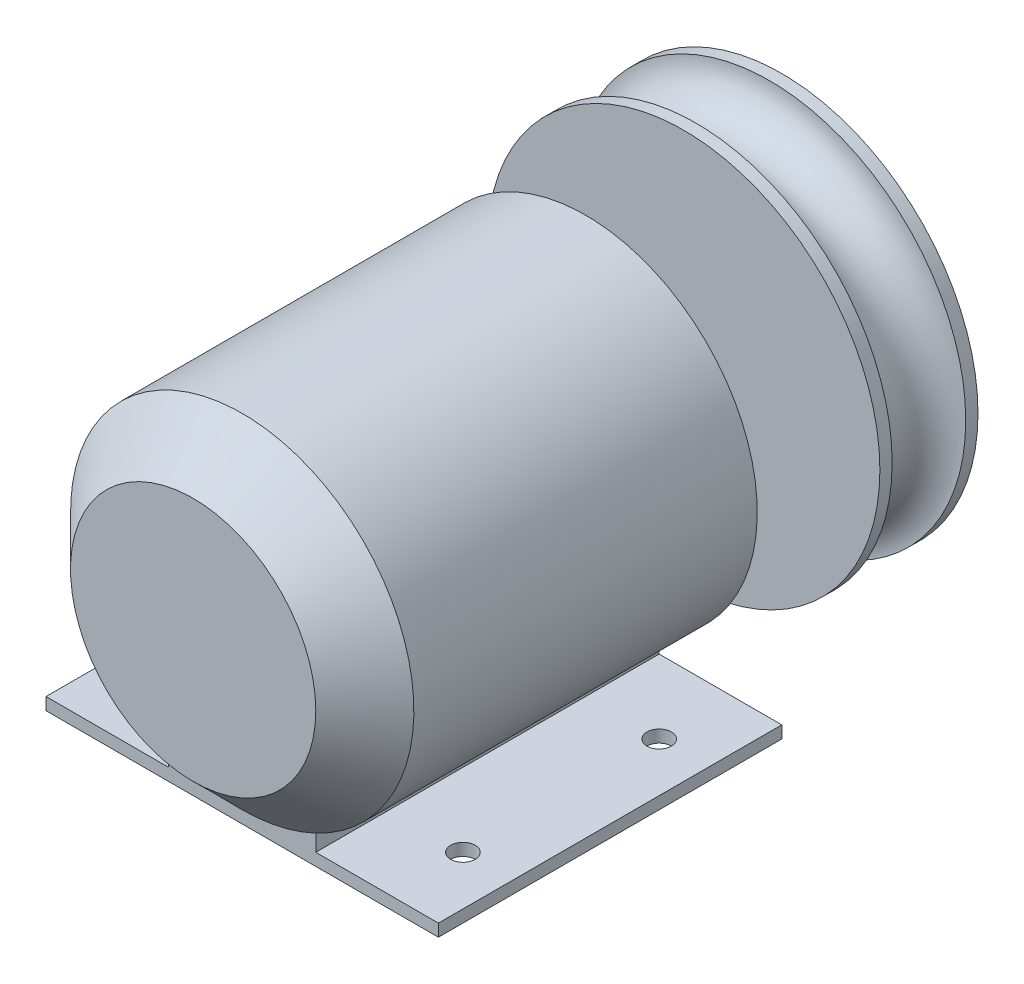
ISO-10303-21;
HEADER;
FILE_DESCRIPTION(('STEP AP214'),'2;1');
FILE_NAME('part.step','',(''),(''),'','','');
FILE_SCHEMA(('AUTOMOTIVE_DESIGN { 1 0 10303 214 1 1 1 1 }'));
ENDSEC;
DATA;
#1=APPLICATION_CONTEXT('core data for automotive mechanical design processes');
#2=APPLICATION_PROTOCOL_DEFINITION('international standard','automotive_design',2000,#1);
#3=PRODUCT_CONTEXT('',#1,'mechanical');
#4=PRODUCT('Part','Part','',(#3));
#5=PRODUCT_RELATED_PRODUCT_CATEGORY('part','',(#4));
#6=PRODUCT_DEFINITION_FORMATION('','',#4);
#7=PRODUCT_DEFINITION_CONTEXT('part definition',#1,'design');
#8=PRODUCT_DEFINITION('design','',#6,#7);
#9=PRODUCT_DEFINITION_SHAPE('','',#8);
#10=(LENGTH_UNIT() NAMED_UNIT(*) SI_UNIT(.MILLI.,.METRE.));
#11=(NAMED_UNIT(*) PLANE_ANGLE_UNIT() SI_UNIT($,.RADIAN.));
#12=(NAMED_UNIT(*) SI_UNIT($,.STERADIAN.) SOLID_ANGLE_UNIT());
#13=UNCERTAINTY_MEASURE_WITH_UNIT(LENGTH_MEASURE(1.E-05),#10,'distance_accuracy_value','');
#14=(GEOMETRIC_REPRESENTATION_CONTEXT(3) GLOBAL_UNCERTAINTY_ASSIGNED_CONTEXT((#13)) GLOBAL_UNIT_ASSIGNED_CONTEXT((#10,
#11,#12)) REPRESENTATION_CONTEXT('',''));
#15=CARTESIAN_POINT('',(0.,0.,0.));
#16=DIRECTION('',(0.,0.,1.));
#17=DIRECTION('',(1.,0.,0.));
#18=AXIS2_PLACEMENT_3D('',#15,#16,#17);
#19=CARTESIAN_POINT('',(0.,0.,0.));
#20=DIRECTION('',(0.,0.,1.));
#21=DIRECTION('',(1.,0.,0.));
#22=AXIS2_PLACEMENT_3D('',#19,#20,#21);
#23=PLANE('',#22);
#24=DIRECTION('',(0.,-1.,0.));
#25=VECTOR('',#24,1.);
#26=CARTESIAN_POINT('',(-19.05,-44.45,0.));
#27=LINE('',#26,#25);
#28=CARTESIAN_POINT('',(-19.05,-40.1609262841384,0.));
#29=VERTEX_POINT('',#28);
#30=CARTESIAN_POINT('',(-19.05,-44.45,0.));
#31=VERTEX_POINT('',#30);
#32=EDGE_CURVE('E138',#29,#31,#27,.T.);
#33=ORIENTED_EDGE('',*,*,#32,.F.);
#34=CARTESIAN_POINT('',(0.,0.,0.));
#35=DIRECTION('',(0.,0.,1.));
#36=DIRECTION('',(1.,0.,0.));
#37=AXIS2_PLACEMENT_3D('',#34,#35,#36);
#38=CIRCLE('',#37,44.45);
#39=CARTESIAN_POINT('',(19.05,-40.1609262841384,0.));
#40=VERTEX_POINT('',#39);
#41=EDGE_CURVE('E55',#40,#29,#38,.T.);
#42=ORIENTED_EDGE('',*,*,#41,.F.);
#43=DIRECTION('',(0.,1.,0.));
#44=VECTOR('',#43,1.);
#45=CARTESIAN_POINT('',(19.05,-44.45,0.));
#46=LINE('',#45,#44);
#47=CARTESIAN_POINT('',(19.05,-44.45,0.));
#48=VERTEX_POINT('',#47);
#49=EDGE_CURVE('E141',#48,#40,#46,.T.);
#50=ORIENTED_EDGE('',*,*,#49,.F.);
#51=DIRECTION('',(-1.,0.,0.));
#52=VECTOR('',#51,1.);
#53=CARTESIAN_POINT('',(50.8,-44.45,0.));
#54=LINE('',#53,#52);
#55=CARTESIAN_POINT('',(50.8,-44.45,0.));
#56=VERTEX_POINT('',#55);
#57=EDGE_CURVE('E208',#56,#48,#54,.T.);
#58=ORIENTED_EDGE('',*,*,#57,.F.);
#59=DIRECTION('',(0.,1.,0.));
#60=VECTOR('',#59,1.);
#61=CARTESIAN_POINT('',(50.8,-44.45,0.));
#62=LINE('',#61,#60);
#63=CARTESIAN_POINT('',(50.8,-47.625,0.));
#64=VERTEX_POINT('',#63);
#65=EDGE_CURVE('E126',#64,#56,#62,.T.);
#66=ORIENTED_EDGE('',*,*,#65,.F.);
#67=DIRECTION('',(1.,0.,0.));
#68=VECTOR('',#67,1.);
#69=CARTESIAN_POINT('',(50.8,-47.625,0.));
#70=LINE('',#69,#68);
#71=CARTESIAN_POINT('',(-50.8,-47.625,0.));
#72=VERTEX_POINT('',#71);
#73=EDGE_CURVE('E122',#72,#64,#70,.T.);
#74=ORIENTED_EDGE('',*,*,#73,.F.);
#75=DIRECTION('',(0.,-1.,0.));
#76=VECTOR('',#75,1.);
#77=CARTESIAN_POINT('',(-50.8,-44.45,0.));
#78=LINE('',#77,#76);
#79=CARTESIAN_POINT('',(-50.8,-44.45,0.));
#80=VERTEX_POINT('',#79);
#81=EDGE_CURVE('E210',#80,#72,#78,.T.);
#82=ORIENTED_EDGE('',*,*,#81,.F.);
#83=EDGE_CURVE('E207',#31,#80,#54,.T.);
#84=ORIENTED_EDGE('',*,*,#83,.F.);
#85=EDGE_LOOP('',(#33,#42,#50,#58,#66,#74,#82,#84));
#86=FACE_BOUND('',#85,.T.);
#87=CARTESIAN_POINT('',(0.,0.,0.));
#88=DIRECTION('',(0.,0.,1.));
#89=DIRECTION('',(1.,0.,0.));
#90=AXIS2_PLACEMENT_3D('',#87,#88,#89);
#91=CIRCLE('',#90,3.175);
#92=CARTESIAN_POINT('',(3.175,0.,0.));
#93=VERTEX_POINT('',#92);
#94=EDGE_CURVE('E11',#93,#93,#91,.F.);
#95=ORIENTED_EDGE('',*,*,#94,.F.);
#96=EDGE_LOOP('',(#95));
#97=FACE_BOUND('',#96,.T.);
#98=ADVANCED_FACE('F34',(#86,#97),#23,.F.);
#99=CARTESIAN_POINT('',(0.,0.,101.6));
#100=DIRECTION('',(0.,0.,-1.));
#101=DIRECTION('',(-1.,0.,0.));
#102=AXIS2_PLACEMENT_3D('',#99,#100,#101);
#103=CYLINDRICAL_SURFACE('',#102,44.45);
#104=ORIENTED_EDGE('',*,*,#41,.T.);
#105=DIRECTION('',(0.,0.,-1.));
#106=VECTOR('',#105,1.);
#107=CARTESIAN_POINT('',(-19.05,-40.1609262841384,101.6));
#108=LINE('',#107,#106);
#109=CARTESIAN_POINT('',(-19.05,-40.1609262841384,88.9));
#110=VERTEX_POINT('',#109);
#111=EDGE_CURVE('E150',#29,#110,#108,.F.);
#112=ORIENTED_EDGE('',*,*,#111,.T.);
#113=CARTESIAN_POINT('',(0.,0.,88.9));
#114=DIRECTION('',(0.,0.,1.));
#115=DIRECTION('',(1.,0.,0.));
#116=AXIS2_PLACEMENT_3D('',#113,#114,#115);
#117=CIRCLE('',#116,44.45);
#118=CARTESIAN_POINT('',(19.05,-40.1609262841384,88.9));
#119=VERTEX_POINT('',#118);
#120=EDGE_CURVE('E177',#110,#119,#117,.F.);
#121=ORIENTED_EDGE('',*,*,#120,.T.);
#122=DIRECTION('',(0.,0.,-1.));
#123=VECTOR('',#122,1.);
#124=CARTESIAN_POINT('',(19.05,-40.1609262841384,101.6));
#125=LINE('',#124,#123);
#126=EDGE_CURVE('E51',#119,#40,#125,.T.);
#127=ORIENTED_EDGE('',*,*,#126,.T.);
#128=EDGE_LOOP('',(#104,#112,#121,#127));
#129=FACE_BOUND('',#128,.T.);
#130=ADVANCED_FACE('F232',(#129),#103,.T.);
#131=CARTESIAN_POINT('',(0.,0.,101.6));
#132=DIRECTION('',(0.,0.,1.));
#133=DIRECTION('',(1.,0.,0.));
#134=AXIS2_PLACEMENT_3D('',#131,#132,#133);
#135=PLANE('',#134);
#136=CARTESIAN_POINT('',(0.,0.,101.6));
#137=DIRECTION('',(0.,0.,1.));
#138=DIRECTION('',(1.,0.,0.));
#139=AXIS2_PLACEMENT_3D('',#136,#137,#138);
#140=CIRCLE('',#139,31.75);
#141=CARTESIAN_POINT('',(31.75,0.,101.6));
#142=VERTEX_POINT('',#141);
#143=EDGE_CURVE('E174',#142,#142,#140,.T.);
#144=ORIENTED_EDGE('',*,*,#143,.T.);
#145=EDGE_LOOP('',(#144));
#146=FACE_BOUND('',#145,.T.);
#147=ADVANCED_FACE('F256',(#146),#135,.T.);
#148=CARTESIAN_POINT('',(0.,0.,101.6));
#149=DIRECTION('',(0.,0.,-1.));
#150=DIRECTION('',(-1.,0.,0.));
#151=AXIS2_PLACEMENT_3D('',#148,#149,#150);
#152=CONICAL_SURFACE('',#151,31.75,0.785398163397447);
#153=EDGE_CURVE('E43',#119,#110,#117,.F.);
#154=ORIENTED_EDGE('',*,*,#153,.F.);
#155=ORIENTED_EDGE('',*,*,#120,.F.);
#156=EDGE_LOOP('',(#154,#155));
#157=FACE_BOUND('',#156,.T.);
#158=ORIENTED_EDGE('',*,*,#143,.F.);
#159=EDGE_LOOP('',(#158));
#160=FACE_BOUND('',#159,.T.);
#161=ADVANCED_FACE('F36',(#157,#160),#152,.T.);
#162=CARTESIAN_POINT('',(0.,0.,-25.4));
#163=DIRECTION('',(0.,0.,1.));
#164=DIRECTION('',(1.,0.,0.));
#165=AXIS2_PLACEMENT_3D('',#162,#163,#164);
#166=CYLINDRICAL_SURFACE('',#165,3.175);
#167=CARTESIAN_POINT('',(0.,0.,-25.4));
#168=DIRECTION('',(0.,0.,-1.));
#169=DIRECTION('',(-1.,0.,0.));
#170=AXIS2_PLACEMENT_3D('',#167,#168,#169);
#171=CIRCLE('',#170,3.175);
#172=CARTESIAN_POINT('',(-3.175,0.,-25.4));
#173=VERTEX_POINT('',#172);
#174=EDGE_CURVE('E170',#173,#173,#171,.T.);
#175=ORIENTED_EDGE('',*,*,#174,.F.);
#176=EDGE_LOOP('',(#175));
#177=FACE_BOUND('',#176,.T.);
#178=ORIENTED_EDGE('',*,*,#94,.T.);
#179=EDGE_LOOP('',(#178));
#180=FACE_BOUND('',#179,.T.);
#181=ADVANCED_FACE('F261',(#177,#180),#166,.T.);
#182=CARTESIAN_POINT('',(0.,0.,-25.4));
#183=DIRECTION('',(0.,0.,-1.));
#184=DIRECTION('',(-1.,0.,0.));
#185=AXIS2_PLACEMENT_3D('',#182,#183,#184);
#186=PLANE('',#185);
#187=CARTESIAN_POINT('',(0.,0.,-25.4));
#188=DIRECTION('',(0.,0.,1.));
#189=DIRECTION('',(1.,0.,0.));
#190=AXIS2_PLACEMENT_3D('',#187,#188,#189);
#191=CIRCLE('',#190,50.8);
#192=CARTESIAN_POINT('',(50.8,0.,-25.4));
#193=VERTEX_POINT('',#192);
#194=EDGE_CURVE('E156',#193,#193,#191,.T.);
#195=ORIENTED_EDGE('',*,*,#194,.T.);
#196=EDGE_LOOP('',(#195));
#197=FACE_BOUND('',#196,.T.);
#198=ORIENTED_EDGE('',*,*,#174,.T.);
#199=EDGE_LOOP('',(#198));
#200=FACE_BOUND('',#199,.T.);
#201=ADVANCED_FACE('F264',(#197,#200),#186,.F.);
#202=CARTESIAN_POINT('',(0.,0.,-50.8));
#203=DIRECTION('',(0.,0.,1.));
#204=DIRECTION('',(1.,0.,0.));
#205=AXIS2_PLACEMENT_3D('',#202,#203,#204);
#206=PLANE('',#205);
#207=CARTESIAN_POINT('',(0.,0.,-50.8));
#208=DIRECTION('',(0.,0.,-1.));
#209=DIRECTION('',(-1.,0.,0.));
#210=AXIS2_PLACEMENT_3D('',#207,#208,#209);
#211=CIRCLE('',#210,44.45);
#212=CARTESIAN_POINT('',(-44.45,0.,-50.8));
#213=VERTEX_POINT('',#212);
#214=EDGE_CURVE('E152',#213,#213,#211,.T.);
#215=ORIENTED_EDGE('',*,*,#214,.F.);
#216=EDGE_LOOP('',(#215));
#217=FACE_BOUND('',#216,.T.);
#218=CARTESIAN_POINT('',(0.,0.,-50.8));
#219=DIRECTION('',(0.,0.,1.));
#220=DIRECTION('',(1.,0.,0.));
#221=AXIS2_PLACEMENT_3D('',#218,#219,#220);
#222=CIRCLE('',#221,50.8);
#223=CARTESIAN_POINT('',(50.8,0.,-50.8));
#224=VERTEX_POINT('',#223);
#225=EDGE_CURVE('E167',#224,#224,#222,.T.);
#226=ORIENTED_EDGE('',*,*,#225,.F.);
#227=EDGE_LOOP('',(#226));
#228=FACE_BOUND('',#227,.T.);
#229=ADVANCED_FACE('F268',(#217,#228),#206,.F.);
#230=CARTESIAN_POINT('',(0.,0.,-25.4));
#231=DIRECTION('',(0.,0.,1.));
#232=DIRECTION('',(1.,0.,0.));
#233=AXIS2_PLACEMENT_3D('',#230,#231,#232);
#234=CYLINDRICAL_SURFACE('',#233,50.8);
#235=CARTESIAN_POINT('',(0.,0.,-47.625));
#236=DIRECTION('',(0.,0.,1.));
#237=DIRECTION('',(1.,0.,0.));
#238=AXIS2_PLACEMENT_3D('',#235,#236,#237);
#239=CIRCLE('',#238,50.8);
#240=CARTESIAN_POINT('',(50.8,0.,-47.625));
#241=VERTEX_POINT('',#240);
#242=EDGE_CURVE('E164',#241,#241,#239,.T.);
#243=ORIENTED_EDGE('',*,*,#242,.F.);
#244=EDGE_LOOP('',(#243));
#245=FACE_BOUND('',#244,.T.);
#246=ORIENTED_EDGE('',*,*,#225,.T.);
#247=EDGE_LOOP('',(#246));
#248=FACE_BOUND('',#247,.T.);
#249=ADVANCED_FACE('F272',(#245,#248),#234,.T.);
#250=CARTESIAN_POINT('',(0.,0.,-38.1));
#251=DIRECTION('',(0.,0.,1.));
#252=DIRECTION('',(1.,0.,0.));
#253=AXIS2_PLACEMENT_3D('',#250,#251,#252);
#254=TOROIDAL_SURFACE('',#253,50.8,9.525);
#255=CARTESIAN_POINT('',(0.,0.,-28.575));
#256=DIRECTION('',(0.,0.,1.));
#257=DIRECTION('',(1.,0.,0.));
#258=AXIS2_PLACEMENT_3D('',#255,#256,#257);
#259=CIRCLE('',#258,50.8);
#260=CARTESIAN_POINT('',(50.8,0.,-28.575));
#261=VERTEX_POINT('',#260);
#262=EDGE_CURVE('E161',#261,#261,#259,.T.);
#263=ORIENTED_EDGE('',*,*,#262,.F.);
#264=EDGE_LOOP('',(#263));
#265=FACE_BOUND('',#264,.T.);
#266=ORIENTED_EDGE('',*,*,#242,.T.);
#267=EDGE_LOOP('',(#266));
#268=FACE_BOUND('',#267,.T.);
#269=ADVANCED_FACE('F276',(#265,#268),#254,.F.);
#270=CARTESIAN_POINT('',(0.,0.,-25.4));
#271=DIRECTION('',(0.,0.,1.));
#272=DIRECTION('',(1.,0.,0.));
#273=AXIS2_PLACEMENT_3D('',#270,#271,#272);
#274=CYLINDRICAL_SURFACE('',#273,50.8);
#275=ORIENTED_EDGE('',*,*,#194,.F.);
#276=EDGE_LOOP('',(#275));
#277=FACE_BOUND('',#276,.T.);
#278=ORIENTED_EDGE('',*,*,#262,.T.);
#279=EDGE_LOOP('',(#278));
#280=FACE_BOUND('',#279,.T.);
#281=ADVANCED_FACE('F280',(#277,#280),#274,.T.);
#282=CARTESIAN_POINT('',(0.,0.,-47.625));
#283=DIRECTION('',(0.,0.,-1.));
#284=DIRECTION('',(-1.,0.,0.));
#285=AXIS2_PLACEMENT_3D('',#282,#283,#284);
#286=CYLINDRICAL_SURFACE('',#285,44.45);
#287=CARTESIAN_POINT('',(0.,0.,-47.625));
#288=DIRECTION('',(0.,0.,-1.));
#289=DIRECTION('',(-1.,0.,0.));
#290=AXIS2_PLACEMENT_3D('',#287,#288,#289);
#291=CIRCLE('',#290,44.45);
#292=CARTESIAN_POINT('',(-44.45,0.,-47.625));
#293=VERTEX_POINT('',#292);
#294=EDGE_CURVE('E153',#293,#293,#291,.T.);
#295=ORIENTED_EDGE('',*,*,#294,.F.);
#296=EDGE_LOOP('',(#295));
#297=FACE_BOUND('',#296,.T.);
#298=ORIENTED_EDGE('',*,*,#214,.T.);
#299=EDGE_LOOP('',(#298));
#300=FACE_BOUND('',#299,.T.);
#301=ADVANCED_FACE('F284',(#297,#300),#286,.F.);
#302=CARTESIAN_POINT('',(0.,0.,-47.625));
#303=DIRECTION('',(0.,0.,-1.));
#304=DIRECTION('',(-1.,0.,0.));
#305=AXIS2_PLACEMENT_3D('',#302,#303,#304);
#306=PLANE('',#305);
#307=ORIENTED_EDGE('',*,*,#294,.T.);
#308=EDGE_LOOP('',(#307));
#309=FACE_BOUND('',#308,.T.);
#310=ADVANCED_FACE('F288',(#309),#306,.T.);
#311=CARTESIAN_POINT('',(-19.05,-44.45,0.));
#312=DIRECTION('',(-1.,0.,0.));
#313=DIRECTION('',(0.,-1.,0.));
#314=AXIS2_PLACEMENT_3D('',#311,#312,#313);
#315=PLANE('',#314);
#316=ORIENTED_EDGE('',*,*,#111,.F.);
#317=ORIENTED_EDGE('',*,*,#32,.T.);
#318=DIRECTION('',(0.,0.,1.));
#319=VECTOR('',#318,1.);
#320=CARTESIAN_POINT('',(-19.05,-44.45,0.));
#321=LINE('',#320,#319);
#322=CARTESIAN_POINT('',(-19.05,-44.45,88.9));
#323=VERTEX_POINT('',#322);
#324=EDGE_CURVE('E143',#31,#323,#321,.T.);
#325=ORIENTED_EDGE('',*,*,#324,.T.);
#326=DIRECTION('',(0.,-1.,0.));
#327=VECTOR('',#326,1.);
#328=CARTESIAN_POINT('',(-19.05,-44.45,88.9));
#329=LINE('',#328,#327);
#330=EDGE_CURVE('E127',#110,#323,#329,.T.);
#331=ORIENTED_EDGE('',*,*,#330,.F.);
#332=EDGE_LOOP('',(#316,#317,#325,#331));
#333=FACE_BOUND('',#332,.T.);
#334=ADVANCED_FACE('F235',(#333),#315,.T.);
#335=CARTESIAN_POINT('',(19.05,-44.45,0.));
#336=DIRECTION('',(1.,0.,0.));
#337=DIRECTION('',(0.,1.,0.));
#338=AXIS2_PLACEMENT_3D('',#335,#336,#337);
#339=PLANE('',#338);
#340=ORIENTED_EDGE('',*,*,#126,.F.);
#341=DIRECTION('',(0.,1.,0.));
#342=VECTOR('',#341,1.);
#343=CARTESIAN_POINT('',(19.05,-44.45,88.9));
#344=LINE('',#343,#342);
#345=CARTESIAN_POINT('',(19.05,-44.45,88.9));
#346=VERTEX_POINT('',#345);
#347=EDGE_CURVE('E131',#346,#119,#344,.T.);
#348=ORIENTED_EDGE('',*,*,#347,.F.);
#349=DIRECTION('',(0.,0.,1.));
#350=VECTOR('',#349,1.);
#351=CARTESIAN_POINT('',(19.05,-44.45,0.));
#352=LINE('',#351,#350);
#353=EDGE_CURVE('E107',#48,#346,#352,.T.);
#354=ORIENTED_EDGE('',*,*,#353,.F.);
#355=ORIENTED_EDGE('',*,*,#49,.T.);
#356=EDGE_LOOP('',(#340,#348,#354,#355));
#357=FACE_BOUND('',#356,.T.);
#358=ADVANCED_FACE('F227',(#357),#339,.T.);
#359=CARTESIAN_POINT('',(0.,0.,88.9));
#360=DIRECTION('',(0.,0.,-1.));
#361=DIRECTION('',(-1.,0.,0.));
#362=AXIS2_PLACEMENT_3D('',#359,#360,#361);
#363=PLANE('',#362);
#364=ORIENTED_EDGE('',*,*,#153,.T.);
#365=ORIENTED_EDGE('',*,*,#330,.T.);
#366=DIRECTION('',(-1.,0.,0.));
#367=VECTOR('',#366,1.);
#368=CARTESIAN_POINT('',(50.8,-44.45,88.9));
#369=LINE('',#368,#367);
#370=CARTESIAN_POINT('',(-50.8,-44.45,88.9));
#371=VERTEX_POINT('',#370);
#372=EDGE_CURVE('E112',#323,#371,#369,.T.);
#373=ORIENTED_EDGE('',*,*,#372,.T.);
#374=DIRECTION('',(0.,-1.,0.));
#375=VECTOR('',#374,1.);
#376=CARTESIAN_POINT('',(-50.8,-44.45,88.9));
#377=LINE('',#376,#375);
#378=CARTESIAN_POINT('',(-50.8,-47.625,88.9));
#379=VERTEX_POINT('',#378);
#380=EDGE_CURVE('E111',#371,#379,#377,.T.);
#381=ORIENTED_EDGE('',*,*,#380,.T.);
#382=DIRECTION('',(1.,0.,0.));
#383=VECTOR('',#382,1.);
#384=CARTESIAN_POINT('',(50.8,-47.625,88.9));
#385=LINE('',#384,#383);
#386=CARTESIAN_POINT('',(50.8,-47.625,88.9));
#387=VERTEX_POINT('',#386);
#388=EDGE_CURVE('E118',#379,#387,#385,.T.);
#389=ORIENTED_EDGE('',*,*,#388,.T.);
#390=DIRECTION('',(0.,1.,0.));
#391=VECTOR('',#390,1.);
#392=CARTESIAN_POINT('',(50.8,-44.45,88.9));
#393=LINE('',#392,#391);
#394=CARTESIAN_POINT('',(50.8,-44.45,88.9));
#395=VERTEX_POINT('',#394);
#396=EDGE_CURVE('E115',#387,#395,#393,.T.);
#397=ORIENTED_EDGE('',*,*,#396,.T.);
#398=EDGE_CURVE('E100',#395,#346,#369,.T.);
#399=ORIENTED_EDGE('',*,*,#398,.T.);
#400=ORIENTED_EDGE('',*,*,#347,.T.);
#401=EDGE_LOOP('',(#364,#365,#373,#381,#389,#397,#399,#400));
#402=FACE_BOUND('',#401,.T.);
#403=ADVANCED_FACE('F116',(#402),#363,.F.);
#404=CARTESIAN_POINT('',(50.8,-44.45,88.9));
#405=DIRECTION('',(0.,-1.,0.));
#406=DIRECTION('',(1.,0.,0.));
#407=AXIS2_PLACEMENT_3D('',#404,#405,#406);
#408=PLANE('',#407);
#409=CARTESIAN_POINT('',(-38.1,-44.45,69.85));
#410=DIRECTION('',(0.,1.,0.));
#411=DIRECTION('',(-1.,0.,0.));
#412=AXIS2_PLACEMENT_3D('',#409,#410,#411);
#413=CIRCLE('',#412,3.175);
#414=CARTESIAN_POINT('',(-41.275,-44.45,69.85));
#415=VERTEX_POINT('',#414);
#416=EDGE_CURVE('E198',#415,#415,#413,.T.);
#417=ORIENTED_EDGE('',*,*,#416,.F.);
#418=EDGE_LOOP('',(#417));
#419=FACE_BOUND('',#418,.T.);
#420=CARTESIAN_POINT('',(-38.1,-44.45,19.05));
#421=DIRECTION('',(0.,1.,0.));
#422=DIRECTION('',(-1.,0.,0.));
#423=AXIS2_PLACEMENT_3D('',#420,#421,#422);
#424=CIRCLE('',#423,3.175);
#425=CARTESIAN_POINT('',(-41.275,-44.45,19.05));
#426=VERTEX_POINT('',#425);
#427=EDGE_CURVE('E188',#426,#426,#424,.T.);
#428=ORIENTED_EDGE('',*,*,#427,.F.);
#429=EDGE_LOOP('',(#428));
#430=FACE_BOUND('',#429,.T.);
#431=ORIENTED_EDGE('',*,*,#324,.F.);
#432=ORIENTED_EDGE('',*,*,#83,.T.);
#433=DIRECTION('',(0.,0.,-1.));
#434=VECTOR('',#433,1.);
#435=CARTESIAN_POINT('',(-50.8,-44.45,88.9));
#436=LINE('',#435,#434);
#437=EDGE_CURVE('E128',#371,#80,#436,.T.);
#438=ORIENTED_EDGE('',*,*,#437,.F.);
#439=ORIENTED_EDGE('',*,*,#372,.F.);
#440=EDGE_LOOP('',(#431,#432,#438,#439));
#441=FACE_BOUND('',#440,.T.);
#442=ADVANCED_FACE('F237',(#419,#430,#441),#408,.F.);
#443=CARTESIAN_POINT('',(50.8,-44.45,88.9));
#444=DIRECTION('',(-1.,0.,0.));
#445=DIRECTION('',(0.,-1.,0.));
#446=AXIS2_PLACEMENT_3D('',#443,#444,#445);
#447=PLANE('',#446);
#448=ORIENTED_EDGE('',*,*,#65,.T.);
#449=DIRECTION('',(0.,0.,-1.));
#450=VECTOR('',#449,1.);
#451=CARTESIAN_POINT('',(50.8,-44.45,88.9));
#452=LINE('',#451,#450);
#453=EDGE_CURVE('E104',#395,#56,#452,.T.);
#454=ORIENTED_EDGE('',*,*,#453,.F.);
#455=ORIENTED_EDGE('',*,*,#396,.F.);
#456=DIRECTION('',(0.,0.,-1.));
#457=VECTOR('',#456,1.);
#458=CARTESIAN_POINT('',(50.8,-47.625,88.9));
#459=LINE('',#458,#457);
#460=EDGE_CURVE('E205',#387,#64,#459,.T.);
#461=ORIENTED_EDGE('',*,*,#460,.T.);
#462=EDGE_LOOP('',(#448,#454,#455,#461));
#463=FACE_BOUND('',#462,.T.);
#464=ADVANCED_FACE('F124',(#463),#447,.F.);
#465=CARTESIAN_POINT('',(38.1,-44.45,69.85));
#466=DIRECTION('',(0.,1.,0.));
#467=DIRECTION('',(-1.,0.,0.));
#468=AXIS2_PLACEMENT_3D('',#465,#466,#467);
#469=CIRCLE('',#468,3.175);
#470=CARTESIAN_POINT('',(34.925,-44.45,69.85));
#471=VERTEX_POINT('',#470);
#472=EDGE_CURVE('E185',#471,#471,#469,.T.);
#473=ORIENTED_EDGE('',*,*,#472,.F.);
#474=EDGE_LOOP('',(#473));
#475=FACE_BOUND('',#474,.T.);
#476=CARTESIAN_POINT('',(38.1,-44.45,19.05));
#477=DIRECTION('',(0.,1.,0.));
#478=DIRECTION('',(-1.,0.,0.));
#479=AXIS2_PLACEMENT_3D('',#476,#477,#478);
#480=CIRCLE('',#479,3.175);
#481=CARTESIAN_POINT('',(34.925,-44.45,19.05));
#482=VERTEX_POINT('',#481);
#483=EDGE_CURVE('E182',#482,#482,#480,.T.);
#484=ORIENTED_EDGE('',*,*,#483,.F.);
#485=EDGE_LOOP('',(#484));
#486=FACE_BOUND('',#485,.T.);
#487=ORIENTED_EDGE('',*,*,#353,.T.);
#488=ORIENTED_EDGE('',*,*,#398,.F.);
#489=ORIENTED_EDGE('',*,*,#453,.T.);
#490=ORIENTED_EDGE('',*,*,#57,.T.);
#491=EDGE_LOOP('',(#487,#488,#489,#490));
#492=FACE_BOUND('',#491,.T.);
#493=ADVANCED_FACE('F102',(#475,#486,#492),#408,.F.);
#494=CARTESIAN_POINT('',(-50.8,-44.45,88.9));
#495=DIRECTION('',(1.,0.,0.));
#496=DIRECTION('',(0.,0.,-1.));
#497=AXIS2_PLACEMENT_3D('',#494,#495,#496);
#498=PLANE('',#497);
#499=ORIENTED_EDGE('',*,*,#81,.T.);
#500=DIRECTION('',(0.,0.,-1.));
#501=VECTOR('',#500,1.);
#502=CARTESIAN_POINT('',(-50.8,-47.625,88.9));
#503=LINE('',#502,#501);
#504=EDGE_CURVE('E134',#379,#72,#503,.T.);
#505=ORIENTED_EDGE('',*,*,#504,.F.);
#506=ORIENTED_EDGE('',*,*,#380,.F.);
#507=ORIENTED_EDGE('',*,*,#437,.T.);
#508=EDGE_LOOP('',(#499,#505,#506,#507));
#509=FACE_BOUND('',#508,.T.);
#510=ADVANCED_FACE('F239',(#509),#498,.F.);
#511=CARTESIAN_POINT('',(50.8,-47.625,88.9));
#512=DIRECTION('',(0.,1.,0.));
#513=DIRECTION('',(-1.,0.,0.));
#514=AXIS2_PLACEMENT_3D('',#511,#512,#513);
#515=PLANE('',#514);
#516=CARTESIAN_POINT('',(-38.1,-47.625,69.85));
#517=DIRECTION('',(0.,1.,0.));
#518=DIRECTION('',(-1.,0.,0.));
#519=AXIS2_PLACEMENT_3D('',#516,#517,#518);
#520=CIRCLE('',#519,3.175);
#521=CARTESIAN_POINT('',(-41.275,-47.625,69.85));
#522=VERTEX_POINT('',#521);
#523=EDGE_CURVE('E38',#522,#522,#520,.T.);
#524=ORIENTED_EDGE('',*,*,#523,.T.);
#525=EDGE_LOOP('',(#524));
#526=FACE_BOUND('',#525,.T.);
#527=CARTESIAN_POINT('',(-38.1,-47.625,19.05));
#528=DIRECTION('',(0.,1.,0.));
#529=DIRECTION('',(-1.,0.,0.));
#530=AXIS2_PLACEMENT_3D('',#527,#528,#529);
#531=CIRCLE('',#530,3.175);
#532=CARTESIAN_POINT('',(-41.275,-47.625,19.05));
#533=VERTEX_POINT('',#532);
#534=EDGE_CURVE('E186',#533,#533,#531,.T.);
#535=ORIENTED_EDGE('',*,*,#534,.T.);
#536=EDGE_LOOP('',(#535));
#537=FACE_BOUND('',#536,.T.);
#538=CARTESIAN_POINT('',(38.1,-47.625,69.85));
#539=DIRECTION('',(0.,1.,0.));
#540=DIRECTION('',(-1.,0.,0.));
#541=AXIS2_PLACEMENT_3D('',#538,#539,#540);
#542=CIRCLE('',#541,3.175);
#543=CARTESIAN_POINT('',(34.925,-47.625,69.85));
#544=VERTEX_POINT('',#543);
#545=EDGE_CURVE('E183',#544,#544,#542,.T.);
#546=ORIENTED_EDGE('',*,*,#545,.T.);
#547=EDGE_LOOP('',(#546));
#548=FACE_BOUND('',#547,.T.);
#549=CARTESIAN_POINT('',(38.1,-47.625,19.05));
#550=DIRECTION('',(0.,1.,0.));
#551=DIRECTION('',(-1.,0.,0.));
#552=AXIS2_PLACEMENT_3D('',#549,#550,#551);
#553=CIRCLE('',#552,3.175);
#554=CARTESIAN_POINT('',(34.925,-47.625,19.05));
#555=VERTEX_POINT('',#554);
#556=EDGE_CURVE('E179',#555,#555,#553,.T.);
#557=ORIENTED_EDGE('',*,*,#556,.T.);
#558=EDGE_LOOP('',(#557));
#559=FACE_BOUND('',#558,.T.);
#560=ORIENTED_EDGE('',*,*,#73,.T.);
#561=ORIENTED_EDGE('',*,*,#460,.F.);
#562=ORIENTED_EDGE('',*,*,#388,.F.);
#563=ORIENTED_EDGE('',*,*,#504,.T.);
#564=EDGE_LOOP('',(#560,#561,#562,#563));
#565=FACE_BOUND('',#564,.T.);
#566=ADVANCED_FACE('F217',(#526,#537,#548,#559,#565),#515,.F.);
#567=CARTESIAN_POINT('',(38.1,-133.35,19.05));
#568=DIRECTION('',(0.,1.,0.));
#569=DIRECTION('',(-1.,0.,0.));
#570=AXIS2_PLACEMENT_3D('',#567,#568,#569);
#571=CYLINDRICAL_SURFACE('',#570,3.175);
#572=ORIENTED_EDGE('',*,*,#483,.T.);
#573=EDGE_LOOP('',(#572));
#574=FACE_BOUND('',#573,.T.);
#575=ORIENTED_EDGE('',*,*,#556,.F.);
#576=EDGE_LOOP('',(#575));
#577=FACE_BOUND('',#576,.T.);
#578=ADVANCED_FACE('F246',(#574,#577),#571,.F.);
#579=CARTESIAN_POINT('',(38.1,-133.35,69.85));
#580=DIRECTION('',(0.,1.,0.));
#581=DIRECTION('',(-1.,0.,0.));
#582=AXIS2_PLACEMENT_3D('',#579,#580,#581);
#583=CYLINDRICAL_SURFACE('',#582,3.175);
#584=ORIENTED_EDGE('',*,*,#472,.T.);
#585=EDGE_LOOP('',(#584));
#586=FACE_BOUND('',#585,.T.);
#587=ORIENTED_EDGE('',*,*,#545,.F.);
#588=EDGE_LOOP('',(#587));
#589=FACE_BOUND('',#588,.T.);
#590=ADVANCED_FACE('F322',(#586,#589),#583,.F.);
#591=CARTESIAN_POINT('',(-38.1,-133.35,19.05));
#592=DIRECTION('',(0.,1.,0.));
#593=DIRECTION('',(-1.,0.,0.));
#594=AXIS2_PLACEMENT_3D('',#591,#592,#593);
#595=CYLINDRICAL_SURFACE('',#594,3.175);
#596=ORIENTED_EDGE('',*,*,#427,.T.);
#597=EDGE_LOOP('',(#596));
#598=FACE_BOUND('',#597,.T.);
#599=ORIENTED_EDGE('',*,*,#534,.F.);
#600=EDGE_LOOP('',(#599));
#601=FACE_BOUND('',#600,.T.);
#602=ADVANCED_FACE('F313',(#598,#601),#595,.F.);
#603=CARTESIAN_POINT('',(-38.1,-133.35,69.85));
#604=DIRECTION('',(0.,1.,0.));
#605=DIRECTION('',(-1.,0.,0.));
#606=AXIS2_PLACEMENT_3D('',#603,#604,#605);
#607=CYLINDRICAL_SURFACE('',#606,3.175);
#608=ORIENTED_EDGE('',*,*,#416,.T.);
#609=EDGE_LOOP('',(#608));
#610=FACE_BOUND('',#609,.T.);
#611=ORIENTED_EDGE('',*,*,#523,.F.);
#612=EDGE_LOOP('',(#611));
#613=FACE_BOUND('',#612,.T.);
#614=ADVANCED_FACE('F310',(#610,#613),#607,.F.);
#615=CLOSED_SHELL('',(#98,#130,#147,#161,#181,#201,#229,#249,#269,#281,#301,#310,#334,#358,#403,
#442,#464,#493,#510,#566,#578,#590,#602,#614));
#616=MANIFOLD_SOLID_BREP('B2',#615);
#617=ADVANCED_BREP_SHAPE_REPRESENTATION('',(#18,#616),#14);
#618=SHAPE_DEFINITION_REPRESENTATION(#9,#617);
ENDSEC;
END-ISO-10303-21;
